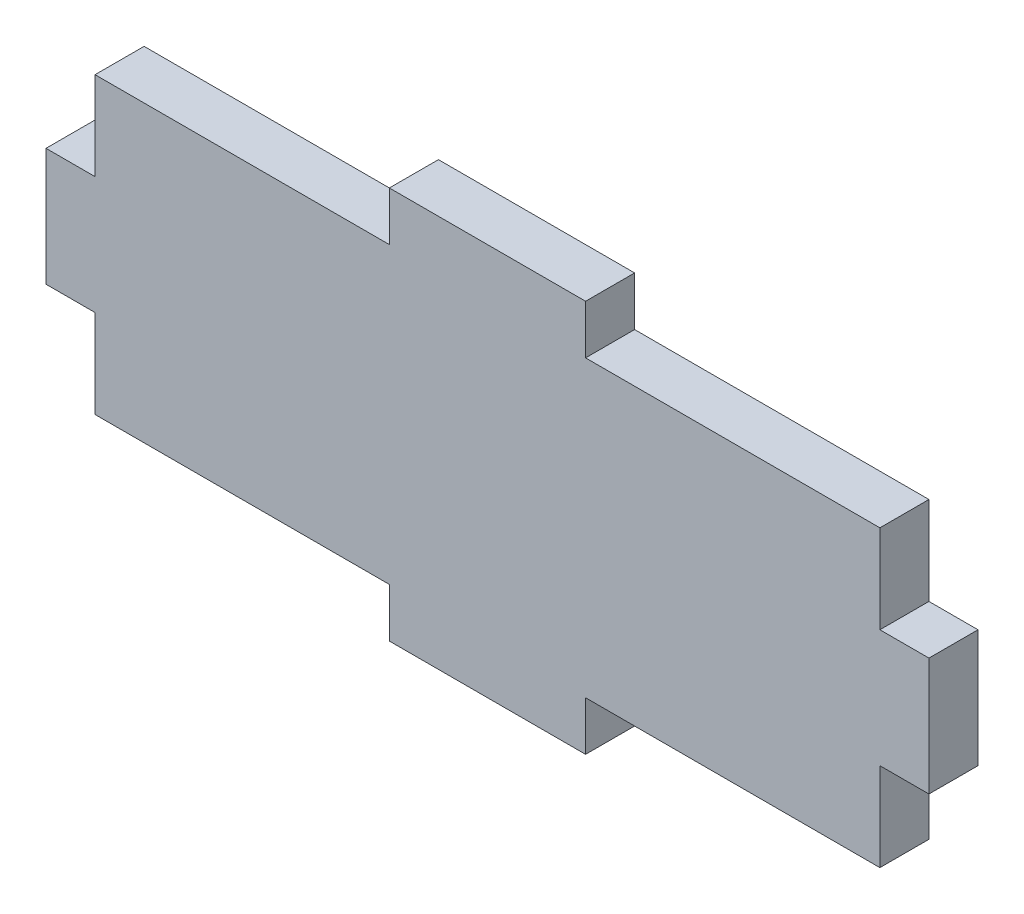
ISO-10303-21;
HEADER;
FILE_DESCRIPTION(('STEP AP214'),'2;1');
FILE_NAME('part.step','',(''),(''),'','','');
FILE_SCHEMA(('AUTOMOTIVE_DESIGN { 1 0 10303 214 1 1 1 1 }'));
ENDSEC;
DATA;
#1=APPLICATION_CONTEXT('core data for automotive mechanical design processes');
#2=APPLICATION_PROTOCOL_DEFINITION('international standard','automotive_design',2000,#1);
#3=PRODUCT_CONTEXT('',#1,'mechanical');
#4=PRODUCT('Part','Part','',(#3));
#5=PRODUCT_RELATED_PRODUCT_CATEGORY('part','',(#4));
#6=PRODUCT_DEFINITION_FORMATION('','',#4);
#7=PRODUCT_DEFINITION_CONTEXT('part definition',#1,'design');
#8=PRODUCT_DEFINITION('design','',#6,#7);
#9=PRODUCT_DEFINITION_SHAPE('','',#8);
#10=(LENGTH_UNIT() NAMED_UNIT(*) SI_UNIT(.MILLI.,.METRE.));
#11=(NAMED_UNIT(*) PLANE_ANGLE_UNIT() SI_UNIT($,.RADIAN.));
#12=(NAMED_UNIT(*) SI_UNIT($,.STERADIAN.) SOLID_ANGLE_UNIT());
#13=UNCERTAINTY_MEASURE_WITH_UNIT(LENGTH_MEASURE(1.E-05),#10,'distance_accuracy_value','');
#14=(GEOMETRIC_REPRESENTATION_CONTEXT(3) GLOBAL_UNCERTAINTY_ASSIGNED_CONTEXT((#13)) GLOBAL_UNIT_ASSIGNED_CONTEXT((#10,
#11,#12)) REPRESENTATION_CONTEXT('',''));
#15=CARTESIAN_POINT('',(0.,0.,0.));
#16=DIRECTION('',(0.,0.,1.));
#17=DIRECTION('',(1.,0.,0.));
#18=AXIS2_PLACEMENT_3D('',#15,#16,#17);
#19=CARTESIAN_POINT('',(-45.,6.,5.));
#20=DIRECTION('',(0.,-1.,0.));
#21=DIRECTION('',(0.,0.,-1.));
#22=AXIS2_PLACEMENT_3D('',#19,#20,#21);
#23=PLANE('',#22);
#24=DIRECTION('',(-1.,0.,0.));
#25=VECTOR('',#24,1.);
#26=CARTESIAN_POINT('',(-45.,6.,0.));
#27=LINE('',#26,#25);
#28=CARTESIAN_POINT('',(-40.,6.,0.));
#29=VERTEX_POINT('',#28);
#30=CARTESIAN_POINT('',(-45.,6.,0.));
#31=VERTEX_POINT('',#30);
#32=EDGE_CURVE('E201',#29,#31,#27,.T.);
#33=ORIENTED_EDGE('',*,*,#32,.T.);
#34=DIRECTION('',(0.,0.,-1.));
#35=VECTOR('',#34,1.);
#36=CARTESIAN_POINT('',(-45.,6.,5.));
#37=LINE('',#36,#35);
#38=CARTESIAN_POINT('',(-45.,6.,5.));
#39=VERTEX_POINT('',#38);
#40=EDGE_CURVE('E11',#39,#31,#37,.T.);
#41=ORIENTED_EDGE('',*,*,#40,.F.);
#42=DIRECTION('',(-1.,0.,0.));
#43=VECTOR('',#42,1.);
#44=CARTESIAN_POINT('',(-45.,6.,5.));
#45=LINE('',#44,#43);
#46=CARTESIAN_POINT('',(-40.,6.,5.));
#47=VERTEX_POINT('',#46);
#48=EDGE_CURVE('E239',#47,#39,#45,.T.);
#49=ORIENTED_EDGE('',*,*,#48,.F.);
#50=DIRECTION('',(0.,0.,-1.));
#51=VECTOR('',#50,1.);
#52=CARTESIAN_POINT('',(-40.,6.,5.));
#53=LINE('',#52,#51);
#54=EDGE_CURVE('E197',#47,#29,#53,.T.);
#55=ORIENTED_EDGE('',*,*,#54,.T.);
#56=EDGE_LOOP('',(#33,#41,#49,#55));
#57=FACE_BOUND('',#56,.T.);
#58=ADVANCED_FACE('F33',(#57),#23,.F.);
#59=CARTESIAN_POINT('',(-45.,-6.00000000000002,5.));
#60=DIRECTION('',(1.,0.,0.));
#61=DIRECTION('',(0.,0.,-1.));
#62=AXIS2_PLACEMENT_3D('',#59,#60,#61);
#63=PLANE('',#62);
#64=DIRECTION('',(0.,-1.,0.));
#65=VECTOR('',#64,1.);
#66=CARTESIAN_POINT('',(-45.,-6.00000000000002,0.));
#67=LINE('',#66,#65);
#68=CARTESIAN_POINT('',(-45.,-6.00000000000002,0.));
#69=VERTEX_POINT('',#68);
#70=EDGE_CURVE('E204',#31,#69,#67,.T.);
#71=ORIENTED_EDGE('',*,*,#70,.T.);
#72=DIRECTION('',(0.,0.,-1.));
#73=VECTOR('',#72,1.);
#74=CARTESIAN_POINT('',(-45.,-6.00000000000002,5.));
#75=LINE('',#74,#73);
#76=CARTESIAN_POINT('',(-45.,-6.00000000000002,5.));
#77=VERTEX_POINT('',#76);
#78=EDGE_CURVE('E41',#77,#69,#75,.T.);
#79=ORIENTED_EDGE('',*,*,#78,.F.);
#80=DIRECTION('',(0.,-1.,0.));
#81=VECTOR('',#80,1.);
#82=CARTESIAN_POINT('',(-45.,-6.00000000000002,5.));
#83=LINE('',#82,#81);
#84=EDGE_CURVE('E128',#39,#77,#83,.T.);
#85=ORIENTED_EDGE('',*,*,#84,.F.);
#86=ORIENTED_EDGE('',*,*,#40,.T.);
#87=EDGE_LOOP('',(#71,#79,#85,#86));
#88=FACE_BOUND('',#87,.T.);
#89=ADVANCED_FACE('F357',(#88),#63,.F.);
#90=CARTESIAN_POINT('',(-45.,-6.00000000000002,5.));
#91=DIRECTION('',(0.,1.,0.));
#92=DIRECTION('',(-1.,0.,0.));
#93=AXIS2_PLACEMENT_3D('',#90,#91,#92);
#94=PLANE('',#93);
#95=DIRECTION('',(1.,0.,0.));
#96=VECTOR('',#95,1.);
#97=CARTESIAN_POINT('',(-45.,-6.00000000000002,0.));
#98=LINE('',#97,#96);
#99=CARTESIAN_POINT('',(-40.,-6.00000000000002,0.));
#100=VERTEX_POINT('',#99);
#101=EDGE_CURVE('E206',#69,#100,#98,.T.);
#102=ORIENTED_EDGE('',*,*,#101,.T.);
#103=DIRECTION('',(0.,0.,-1.));
#104=VECTOR('',#103,1.);
#105=CARTESIAN_POINT('',(-40.,-6.00000000000002,5.));
#106=LINE('',#105,#104);
#107=CARTESIAN_POINT('',(-40.,-6.00000000000002,5.));
#108=VERTEX_POINT('',#107);
#109=EDGE_CURVE('E282',#108,#100,#106,.T.);
#110=ORIENTED_EDGE('',*,*,#109,.F.);
#111=DIRECTION('',(1.,0.,0.));
#112=VECTOR('',#111,1.);
#113=CARTESIAN_POINT('',(-45.,-6.00000000000002,5.));
#114=LINE('',#113,#112);
#115=EDGE_CURVE('E290',#77,#108,#114,.T.);
#116=ORIENTED_EDGE('',*,*,#115,.F.);
#117=ORIENTED_EDGE('',*,*,#78,.T.);
#118=EDGE_LOOP('',(#102,#110,#116,#117));
#119=FACE_BOUND('',#118,.T.);
#120=ADVANCED_FACE('F288',(#119),#94,.F.);
#121=CARTESIAN_POINT('',(-40.,-6.00000000000002,5.));
#122=DIRECTION('',(1.,0.,0.));
#123=DIRECTION('',(0.,1.,0.));
#124=AXIS2_PLACEMENT_3D('',#121,#122,#123);
#125=PLANE('',#124);
#126=DIRECTION('',(0.,-1.,0.));
#127=VECTOR('',#126,1.);
#128=CARTESIAN_POINT('',(-40.,-6.00000000000002,0.));
#129=LINE('',#128,#127);
#130=CARTESIAN_POINT('',(-40.,-15.,0.));
#131=VERTEX_POINT('',#130);
#132=EDGE_CURVE('E208',#100,#131,#129,.T.);
#133=ORIENTED_EDGE('',*,*,#132,.T.);
#134=DIRECTION('',(0.,0.,-1.));
#135=VECTOR('',#134,1.);
#136=CARTESIAN_POINT('',(-40.,-15.,5.));
#137=LINE('',#136,#135);
#138=CARTESIAN_POINT('',(-40.,-15.,5.));
#139=VERTEX_POINT('',#138);
#140=EDGE_CURVE('E279',#139,#131,#137,.T.);
#141=ORIENTED_EDGE('',*,*,#140,.F.);
#142=DIRECTION('',(0.,-1.,0.));
#143=VECTOR('',#142,1.);
#144=CARTESIAN_POINT('',(-40.,-6.00000000000002,5.));
#145=LINE('',#144,#143);
#146=EDGE_CURVE('E308',#108,#139,#145,.T.);
#147=ORIENTED_EDGE('',*,*,#146,.F.);
#148=ORIENTED_EDGE('',*,*,#109,.T.);
#149=EDGE_LOOP('',(#133,#141,#147,#148));
#150=FACE_BOUND('',#149,.T.);
#151=ADVANCED_FACE('F299',(#150),#125,.F.);
#152=CARTESIAN_POINT('',(-40.,-15.,5.));
#153=DIRECTION('',(0.,1.,0.));
#154=DIRECTION('',(-1.,0.,0.));
#155=AXIS2_PLACEMENT_3D('',#152,#153,#154);
#156=PLANE('',#155);
#157=DIRECTION('',(1.,0.,0.));
#158=VECTOR('',#157,1.);
#159=CARTESIAN_POINT('',(-40.,-15.,0.));
#160=LINE('',#159,#158);
#161=CARTESIAN_POINT('',(-10.,-15.,0.));
#162=VERTEX_POINT('',#161);
#163=EDGE_CURVE('E210',#131,#162,#160,.T.);
#164=ORIENTED_EDGE('',*,*,#163,.T.);
#165=DIRECTION('',(0.,0.,-1.));
#166=VECTOR('',#165,1.);
#167=CARTESIAN_POINT('',(-10.,-15.,5.));
#168=LINE('',#167,#166);
#169=CARTESIAN_POINT('',(-10.,-15.,5.));
#170=VERTEX_POINT('',#169);
#171=EDGE_CURVE('E276',#170,#162,#168,.T.);
#172=ORIENTED_EDGE('',*,*,#171,.F.);
#173=DIRECTION('',(1.,0.,0.));
#174=VECTOR('',#173,1.);
#175=CARTESIAN_POINT('',(-40.,-15.,5.));
#176=LINE('',#175,#174);
#177=EDGE_CURVE('E305',#139,#170,#176,.T.);
#178=ORIENTED_EDGE('',*,*,#177,.F.);
#179=ORIENTED_EDGE('',*,*,#140,.T.);
#180=EDGE_LOOP('',(#164,#172,#178,#179));
#181=FACE_BOUND('',#180,.T.);
#182=ADVANCED_FACE('F303',(#181),#156,.F.);
#183=CARTESIAN_POINT('',(-10.,-15.,5.));
#184=DIRECTION('',(1.,0.,0.));
#185=DIRECTION('',(0.,0.,-1.));
#186=AXIS2_PLACEMENT_3D('',#183,#184,#185);
#187=PLANE('',#186);
#188=DIRECTION('',(0.,-1.,0.));
#189=VECTOR('',#188,1.);
#190=CARTESIAN_POINT('',(-10.,-15.,0.));
#191=LINE('',#190,#189);
#192=CARTESIAN_POINT('',(-10.,-20.,0.));
#193=VERTEX_POINT('',#192);
#194=EDGE_CURVE('E212',#162,#193,#191,.T.);
#195=ORIENTED_EDGE('',*,*,#194,.T.);
#196=DIRECTION('',(0.,0.,-1.));
#197=VECTOR('',#196,1.);
#198=CARTESIAN_POINT('',(-10.,-20.,5.));
#199=LINE('',#198,#197);
#200=CARTESIAN_POINT('',(-10.,-20.,5.));
#201=VERTEX_POINT('',#200);
#202=EDGE_CURVE('E273',#201,#193,#199,.T.);
#203=ORIENTED_EDGE('',*,*,#202,.F.);
#204=DIRECTION('',(0.,-1.,0.));
#205=VECTOR('',#204,1.);
#206=CARTESIAN_POINT('',(-10.,-15.,5.));
#207=LINE('',#206,#205);
#208=EDGE_CURVE('E307',#170,#201,#207,.T.);
#209=ORIENTED_EDGE('',*,*,#208,.F.);
#210=ORIENTED_EDGE('',*,*,#171,.T.);
#211=EDGE_LOOP('',(#195,#203,#209,#210));
#212=FACE_BOUND('',#211,.T.);
#213=ADVANCED_FACE('F370',(#212),#187,.F.);
#214=CARTESIAN_POINT('',(-10.,-20.,5.));
#215=DIRECTION('',(0.,1.,0.));
#216=DIRECTION('',(0.,0.,1.));
#217=AXIS2_PLACEMENT_3D('',#214,#215,#216);
#218=PLANE('',#217);
#219=DIRECTION('',(1.,0.,0.));
#220=VECTOR('',#219,1.);
#221=CARTESIAN_POINT('',(-10.,-20.,0.));
#222=LINE('',#221,#220);
#223=CARTESIAN_POINT('',(10.,-20.,0.));
#224=VERTEX_POINT('',#223);
#225=EDGE_CURVE('E214',#193,#224,#222,.T.);
#226=ORIENTED_EDGE('',*,*,#225,.T.);
#227=DIRECTION('',(0.,0.,-1.));
#228=VECTOR('',#227,1.);
#229=CARTESIAN_POINT('',(10.,-20.,5.));
#230=LINE('',#229,#228);
#231=CARTESIAN_POINT('',(10.,-20.,5.));
#232=VERTEX_POINT('',#231);
#233=EDGE_CURVE('E270',#232,#224,#230,.T.);
#234=ORIENTED_EDGE('',*,*,#233,.F.);
#235=DIRECTION('',(1.,0.,0.));
#236=VECTOR('',#235,1.);
#237=CARTESIAN_POINT('',(-10.,-20.,5.));
#238=LINE('',#237,#236);
#239=EDGE_CURVE('E310',#201,#232,#238,.T.);
#240=ORIENTED_EDGE('',*,*,#239,.F.);
#241=ORIENTED_EDGE('',*,*,#202,.T.);
#242=EDGE_LOOP('',(#226,#234,#240,#241));
#243=FACE_BOUND('',#242,.T.);
#244=ADVANCED_FACE('F373',(#243),#218,.F.);
#245=CARTESIAN_POINT('',(10.,-15.,5.));
#246=DIRECTION('',(-1.,0.,0.));
#247=DIRECTION('',(0.,0.,1.));
#248=AXIS2_PLACEMENT_3D('',#245,#246,#247);
#249=PLANE('',#248);
#250=DIRECTION('',(0.,1.,0.));
#251=VECTOR('',#250,1.);
#252=CARTESIAN_POINT('',(10.,-15.,0.));
#253=LINE('',#252,#251);
#254=CARTESIAN_POINT('',(10.,-15.,0.));
#255=VERTEX_POINT('',#254);
#256=EDGE_CURVE('E216',#224,#255,#253,.T.);
#257=ORIENTED_EDGE('',*,*,#256,.T.);
#258=DIRECTION('',(0.,0.,-1.));
#259=VECTOR('',#258,1.);
#260=CARTESIAN_POINT('',(10.,-15.,5.));
#261=LINE('',#260,#259);
#262=CARTESIAN_POINT('',(10.,-15.,5.));
#263=VERTEX_POINT('',#262);
#264=EDGE_CURVE('E267',#263,#255,#261,.T.);
#265=ORIENTED_EDGE('',*,*,#264,.F.);
#266=DIRECTION('',(0.,1.,0.));
#267=VECTOR('',#266,1.);
#268=CARTESIAN_POINT('',(10.,-15.,5.));
#269=LINE('',#268,#267);
#270=EDGE_CURVE('E316',#232,#263,#269,.T.);
#271=ORIENTED_EDGE('',*,*,#270,.F.);
#272=ORIENTED_EDGE('',*,*,#233,.T.);
#273=EDGE_LOOP('',(#257,#265,#271,#272));
#274=FACE_BOUND('',#273,.T.);
#275=ADVANCED_FACE('F377',(#274),#249,.F.);
#276=CARTESIAN_POINT('',(40.,-15.,5.));
#277=DIRECTION('',(0.,1.,0.));
#278=DIRECTION('',(-1.,0.,0.));
#279=AXIS2_PLACEMENT_3D('',#276,#277,#278);
#280=PLANE('',#279);
#281=DIRECTION('',(1.,0.,0.));
#282=VECTOR('',#281,1.);
#283=CARTESIAN_POINT('',(40.,-15.,0.));
#284=LINE('',#283,#282);
#285=CARTESIAN_POINT('',(40.,-15.,0.));
#286=VERTEX_POINT('',#285);
#287=EDGE_CURVE('E218',#255,#286,#284,.T.);
#288=ORIENTED_EDGE('',*,*,#287,.T.);
#289=DIRECTION('',(0.,0.,-1.));
#290=VECTOR('',#289,1.);
#291=CARTESIAN_POINT('',(40.,-15.,5.));
#292=LINE('',#291,#290);
#293=CARTESIAN_POINT('',(40.,-15.,5.));
#294=VERTEX_POINT('',#293);
#295=EDGE_CURVE('E264',#294,#286,#292,.T.);
#296=ORIENTED_EDGE('',*,*,#295,.F.);
#297=DIRECTION('',(1.,0.,0.));
#298=VECTOR('',#297,1.);
#299=CARTESIAN_POINT('',(40.,-15.,5.));
#300=LINE('',#299,#298);
#301=EDGE_CURVE('E318',#263,#294,#300,.T.);
#302=ORIENTED_EDGE('',*,*,#301,.F.);
#303=ORIENTED_EDGE('',*,*,#264,.T.);
#304=EDGE_LOOP('',(#288,#296,#302,#303));
#305=FACE_BOUND('',#304,.T.);
#306=ADVANCED_FACE('F381',(#305),#280,.F.);
#307=CARTESIAN_POINT('',(40.,-6.00000000000001,5.));
#308=DIRECTION('',(-1.,0.,0.));
#309=DIRECTION('',(0.,-1.,0.));
#310=AXIS2_PLACEMENT_3D('',#307,#308,#309);
#311=PLANE('',#310);
#312=DIRECTION('',(0.,1.,0.));
#313=VECTOR('',#312,1.);
#314=CARTESIAN_POINT('',(40.,-6.00000000000001,0.));
#315=LINE('',#314,#313);
#316=CARTESIAN_POINT('',(40.,-6.00000000000001,0.));
#317=VERTEX_POINT('',#316);
#318=EDGE_CURVE('E220',#286,#317,#315,.T.);
#319=ORIENTED_EDGE('',*,*,#318,.T.);
#320=DIRECTION('',(0.,0.,-1.));
#321=VECTOR('',#320,1.);
#322=CARTESIAN_POINT('',(40.,-6.00000000000001,5.));
#323=LINE('',#322,#321);
#324=CARTESIAN_POINT('',(40.,-6.00000000000001,5.));
#325=VERTEX_POINT('',#324);
#326=EDGE_CURVE('E261',#325,#317,#323,.T.);
#327=ORIENTED_EDGE('',*,*,#326,.F.);
#328=DIRECTION('',(0.,1.,0.));
#329=VECTOR('',#328,1.);
#330=CARTESIAN_POINT('',(40.,-6.00000000000001,5.));
#331=LINE('',#330,#329);
#332=EDGE_CURVE('E320',#294,#325,#331,.T.);
#333=ORIENTED_EDGE('',*,*,#332,.F.);
#334=ORIENTED_EDGE('',*,*,#295,.T.);
#335=EDGE_LOOP('',(#319,#327,#333,#334));
#336=FACE_BOUND('',#335,.T.);
#337=ADVANCED_FACE('F385',(#336),#311,.F.);
#338=CARTESIAN_POINT('',(45.,-6.00000000000001,5.));
#339=DIRECTION('',(0.,1.,0.));
#340=DIRECTION('',(-1.,0.,0.));
#341=AXIS2_PLACEMENT_3D('',#338,#339,#340);
#342=PLANE('',#341);
#343=DIRECTION('',(1.,0.,0.));
#344=VECTOR('',#343,1.);
#345=CARTESIAN_POINT('',(45.,-6.00000000000001,0.));
#346=LINE('',#345,#344);
#347=CARTESIAN_POINT('',(45.,-6.00000000000001,0.));
#348=VERTEX_POINT('',#347);
#349=EDGE_CURVE('E222',#317,#348,#346,.T.);
#350=ORIENTED_EDGE('',*,*,#349,.T.);
#351=DIRECTION('',(0.,0.,-1.));
#352=VECTOR('',#351,1.);
#353=CARTESIAN_POINT('',(45.,-6.00000000000001,5.));
#354=LINE('',#353,#352);
#355=CARTESIAN_POINT('',(45.,-6.00000000000001,5.));
#356=VERTEX_POINT('',#355);
#357=EDGE_CURVE('E258',#356,#348,#354,.T.);
#358=ORIENTED_EDGE('',*,*,#357,.F.);
#359=DIRECTION('',(1.,0.,0.));
#360=VECTOR('',#359,1.);
#361=CARTESIAN_POINT('',(45.,-6.00000000000001,5.));
#362=LINE('',#361,#360);
#363=EDGE_CURVE('E322',#325,#356,#362,.T.);
#364=ORIENTED_EDGE('',*,*,#363,.F.);
#365=ORIENTED_EDGE('',*,*,#326,.T.);
#366=EDGE_LOOP('',(#350,#358,#364,#365));
#367=FACE_BOUND('',#366,.T.);
#368=ADVANCED_FACE('F389',(#367),#342,.F.);
#369=CARTESIAN_POINT('',(45.,-6.00000000000001,5.));
#370=DIRECTION('',(-1.,0.,0.));
#371=DIRECTION('',(0.,0.,1.));
#372=AXIS2_PLACEMENT_3D('',#369,#370,#371);
#373=PLANE('',#372);
#374=DIRECTION('',(0.,1.,0.));
#375=VECTOR('',#374,1.);
#376=CARTESIAN_POINT('',(45.,-6.00000000000001,0.));
#377=LINE('',#376,#375);
#378=CARTESIAN_POINT('',(45.,6.00000000000001,0.));
#379=VERTEX_POINT('',#378);
#380=EDGE_CURVE('E224',#348,#379,#377,.T.);
#381=ORIENTED_EDGE('',*,*,#380,.T.);
#382=DIRECTION('',(0.,0.,-1.));
#383=VECTOR('',#382,1.);
#384=CARTESIAN_POINT('',(45.,6.00000000000001,5.));
#385=LINE('',#384,#383);
#386=CARTESIAN_POINT('',(45.,6.00000000000001,5.));
#387=VERTEX_POINT('',#386);
#388=EDGE_CURVE('E255',#387,#379,#385,.T.);
#389=ORIENTED_EDGE('',*,*,#388,.F.);
#390=DIRECTION('',(0.,1.,0.));
#391=VECTOR('',#390,1.);
#392=CARTESIAN_POINT('',(45.,-6.00000000000001,5.));
#393=LINE('',#392,#391);
#394=EDGE_CURVE('E324',#356,#387,#393,.T.);
#395=ORIENTED_EDGE('',*,*,#394,.F.);
#396=ORIENTED_EDGE('',*,*,#357,.T.);
#397=EDGE_LOOP('',(#381,#389,#395,#396));
#398=FACE_BOUND('',#397,.T.);
#399=ADVANCED_FACE('F393',(#398),#373,.F.);
#400=CARTESIAN_POINT('',(45.,6.00000000000001,5.));
#401=DIRECTION('',(0.,-1.,0.));
#402=DIRECTION('',(1.,0.,0.));
#403=AXIS2_PLACEMENT_3D('',#400,#401,#402);
#404=PLANE('',#403);
#405=DIRECTION('',(-1.,0.,0.));
#406=VECTOR('',#405,1.);
#407=CARTESIAN_POINT('',(45.,6.00000000000001,0.));
#408=LINE('',#407,#406);
#409=CARTESIAN_POINT('',(40.,6.00000000000001,0.));
#410=VERTEX_POINT('',#409);
#411=EDGE_CURVE('E226',#379,#410,#408,.T.);
#412=ORIENTED_EDGE('',*,*,#411,.T.);
#413=DIRECTION('',(0.,0.,-1.));
#414=VECTOR('',#413,1.);
#415=CARTESIAN_POINT('',(40.,6.00000000000001,5.));
#416=LINE('',#415,#414);
#417=CARTESIAN_POINT('',(40.,6.00000000000001,5.));
#418=VERTEX_POINT('',#417);
#419=EDGE_CURVE('E252',#418,#410,#416,.T.);
#420=ORIENTED_EDGE('',*,*,#419,.F.);
#421=DIRECTION('',(-1.,0.,0.));
#422=VECTOR('',#421,1.);
#423=CARTESIAN_POINT('',(45.,6.00000000000001,5.));
#424=LINE('',#423,#422);
#425=EDGE_CURVE('E326',#387,#418,#424,.T.);
#426=ORIENTED_EDGE('',*,*,#425,.F.);
#427=ORIENTED_EDGE('',*,*,#388,.T.);
#428=EDGE_LOOP('',(#412,#420,#426,#427));
#429=FACE_BOUND('',#428,.T.);
#430=ADVANCED_FACE('F397',(#429),#404,.F.);
#431=CARTESIAN_POINT('',(40.,6.00000000000001,5.));
#432=DIRECTION('',(-1.,0.,0.));
#433=DIRECTION('',(0.,-1.,0.));
#434=AXIS2_PLACEMENT_3D('',#431,#432,#433);
#435=PLANE('',#434);
#436=DIRECTION('',(0.,1.,0.));
#437=VECTOR('',#436,1.);
#438=CARTESIAN_POINT('',(40.,6.00000000000001,0.));
#439=LINE('',#438,#437);
#440=CARTESIAN_POINT('',(40.,15.,0.));
#441=VERTEX_POINT('',#440);
#442=EDGE_CURVE('E228',#410,#441,#439,.T.);
#443=ORIENTED_EDGE('',*,*,#442,.T.);
#444=DIRECTION('',(0.,0.,-1.));
#445=VECTOR('',#444,1.);
#446=CARTESIAN_POINT('',(40.,15.,5.));
#447=LINE('',#446,#445);
#448=CARTESIAN_POINT('',(40.,15.,5.));
#449=VERTEX_POINT('',#448);
#450=EDGE_CURVE('E249',#449,#441,#447,.T.);
#451=ORIENTED_EDGE('',*,*,#450,.F.);
#452=DIRECTION('',(0.,1.,0.));
#453=VECTOR('',#452,1.);
#454=CARTESIAN_POINT('',(40.,6.00000000000001,5.));
#455=LINE('',#454,#453);
#456=EDGE_CURVE('E328',#418,#449,#455,.T.);
#457=ORIENTED_EDGE('',*,*,#456,.F.);
#458=ORIENTED_EDGE('',*,*,#419,.T.);
#459=EDGE_LOOP('',(#443,#451,#457,#458));
#460=FACE_BOUND('',#459,.T.);
#461=ADVANCED_FACE('F401',(#460),#435,.F.);
#462=CARTESIAN_POINT('',(40.,15.,5.));
#463=DIRECTION('',(0.,-1.,0.));
#464=DIRECTION('',(1.,0.,0.));
#465=AXIS2_PLACEMENT_3D('',#462,#463,#464);
#466=PLANE('',#465);
#467=DIRECTION('',(-1.,0.,0.));
#468=VECTOR('',#467,1.);
#469=CARTESIAN_POINT('',(40.,15.,0.));
#470=LINE('',#469,#468);
#471=CARTESIAN_POINT('',(10.,15.,0.));
#472=VERTEX_POINT('',#471);
#473=EDGE_CURVE('E230',#441,#472,#470,.T.);
#474=ORIENTED_EDGE('',*,*,#473,.T.);
#475=DIRECTION('',(0.,0.,-1.));
#476=VECTOR('',#475,1.);
#477=CARTESIAN_POINT('',(10.,15.,5.));
#478=LINE('',#477,#476);
#479=CARTESIAN_POINT('',(10.,15.,5.));
#480=VERTEX_POINT('',#479);
#481=EDGE_CURVE('E246',#480,#472,#478,.T.);
#482=ORIENTED_EDGE('',*,*,#481,.F.);
#483=DIRECTION('',(-1.,0.,0.));
#484=VECTOR('',#483,1.);
#485=CARTESIAN_POINT('',(40.,15.,5.));
#486=LINE('',#485,#484);
#487=EDGE_CURVE('E330',#449,#480,#486,.T.);
#488=ORIENTED_EDGE('',*,*,#487,.F.);
#489=ORIENTED_EDGE('',*,*,#450,.T.);
#490=EDGE_LOOP('',(#474,#482,#488,#489));
#491=FACE_BOUND('',#490,.T.);
#492=ADVANCED_FACE('F405',(#491),#466,.F.);
#493=CARTESIAN_POINT('',(10.,15.,5.));
#494=DIRECTION('',(-1.,0.,0.));
#495=DIRECTION('',(0.,0.,1.));
#496=AXIS2_PLACEMENT_3D('',#493,#494,#495);
#497=PLANE('',#496);
#498=DIRECTION('',(0.,1.,0.));
#499=VECTOR('',#498,1.);
#500=CARTESIAN_POINT('',(10.,15.,0.));
#501=LINE('',#500,#499);
#502=CARTESIAN_POINT('',(10.,20.,0.));
#503=VERTEX_POINT('',#502);
#504=EDGE_CURVE('E232',#472,#503,#501,.T.);
#505=ORIENTED_EDGE('',*,*,#504,.T.);
#506=DIRECTION('',(0.,0.,-1.));
#507=VECTOR('',#506,1.);
#508=CARTESIAN_POINT('',(10.,20.,5.));
#509=LINE('',#508,#507);
#510=CARTESIAN_POINT('',(10.,20.,5.));
#511=VERTEX_POINT('',#510);
#512=EDGE_CURVE('E243',#511,#503,#509,.T.);
#513=ORIENTED_EDGE('',*,*,#512,.F.);
#514=DIRECTION('',(0.,1.,0.));
#515=VECTOR('',#514,1.);
#516=CARTESIAN_POINT('',(10.,15.,5.));
#517=LINE('',#516,#515);
#518=EDGE_CURVE('E332',#480,#511,#517,.T.);
#519=ORIENTED_EDGE('',*,*,#518,.F.);
#520=ORIENTED_EDGE('',*,*,#481,.T.);
#521=EDGE_LOOP('',(#505,#513,#519,#520));
#522=FACE_BOUND('',#521,.T.);
#523=ADVANCED_FACE('F338',(#522),#497,.F.);
#524=CARTESIAN_POINT('',(-10.,20.,5.));
#525=DIRECTION('',(0.,-1.,0.));
#526=DIRECTION('',(0.,0.,-1.));
#527=AXIS2_PLACEMENT_3D('',#524,#525,#526);
#528=PLANE('',#527);
#529=DIRECTION('',(-1.,0.,0.));
#530=VECTOR('',#529,1.);
#531=CARTESIAN_POINT('',(-10.,20.,0.));
#532=LINE('',#531,#530);
#533=CARTESIAN_POINT('',(-10.,20.,0.));
#534=VERTEX_POINT('',#533);
#535=EDGE_CURVE('E234',#503,#534,#532,.T.);
#536=ORIENTED_EDGE('',*,*,#535,.T.);
#537=DIRECTION('',(0.,0.,-1.));
#538=VECTOR('',#537,1.);
#539=CARTESIAN_POINT('',(-10.,20.,5.));
#540=LINE('',#539,#538);
#541=CARTESIAN_POINT('',(-10.,20.,5.));
#542=VERTEX_POINT('',#541);
#543=EDGE_CURVE('E192',#542,#534,#540,.T.);
#544=ORIENTED_EDGE('',*,*,#543,.F.);
#545=DIRECTION('',(-1.,0.,0.));
#546=VECTOR('',#545,1.);
#547=CARTESIAN_POINT('',(-10.,20.,5.));
#548=LINE('',#547,#546);
#549=EDGE_CURVE('E183',#511,#542,#548,.T.);
#550=ORIENTED_EDGE('',*,*,#549,.F.);
#551=ORIENTED_EDGE('',*,*,#512,.T.);
#552=EDGE_LOOP('',(#536,#544,#550,#551));
#553=FACE_BOUND('',#552,.T.);
#554=ADVANCED_FACE('F342',(#553),#528,.F.);
#555=CARTESIAN_POINT('',(-10.,15.,5.));
#556=DIRECTION('',(1.,0.,0.));
#557=DIRECTION('',(0.,0.,-1.));
#558=AXIS2_PLACEMENT_3D('',#555,#556,#557);
#559=PLANE('',#558);
#560=DIRECTION('',(0.,-1.,0.));
#561=VECTOR('',#560,1.);
#562=CARTESIAN_POINT('',(-10.,15.,0.));
#563=LINE('',#562,#561);
#564=CARTESIAN_POINT('',(-10.,15.,0.));
#565=VERTEX_POINT('',#564);
#566=EDGE_CURVE('E191',#534,#565,#563,.T.);
#567=ORIENTED_EDGE('',*,*,#566,.T.);
#568=DIRECTION('',(0.,0.,-1.));
#569=VECTOR('',#568,1.);
#570=CARTESIAN_POINT('',(-10.,15.,5.));
#571=LINE('',#570,#569);
#572=CARTESIAN_POINT('',(-10.,15.,5.));
#573=VERTEX_POINT('',#572);
#574=EDGE_CURVE('E188',#573,#565,#571,.T.);
#575=ORIENTED_EDGE('',*,*,#574,.F.);
#576=DIRECTION('',(0.,-1.,0.));
#577=VECTOR('',#576,1.);
#578=CARTESIAN_POINT('',(-10.,15.,5.));
#579=LINE('',#578,#577);
#580=EDGE_CURVE('E177',#542,#573,#579,.T.);
#581=ORIENTED_EDGE('',*,*,#580,.F.);
#582=ORIENTED_EDGE('',*,*,#543,.T.);
#583=EDGE_LOOP('',(#567,#575,#581,#582));
#584=FACE_BOUND('',#583,.T.);
#585=ADVANCED_FACE('F189',(#584),#559,.F.);
#586=CARTESIAN_POINT('',(-40.,15.,5.));
#587=DIRECTION('',(0.,-1.,0.));
#588=DIRECTION('',(0.,0.,-1.));
#589=AXIS2_PLACEMENT_3D('',#586,#587,#588);
#590=PLANE('',#589);
#591=DIRECTION('',(-1.,0.,0.));
#592=VECTOR('',#591,1.);
#593=CARTESIAN_POINT('',(-40.,15.,0.));
#594=LINE('',#593,#592);
#595=CARTESIAN_POINT('',(-40.,15.,0.));
#596=VERTEX_POINT('',#595);
#597=EDGE_CURVE('E114',#565,#596,#594,.T.);
#598=ORIENTED_EDGE('',*,*,#597,.T.);
#599=DIRECTION('',(0.,0.,-1.));
#600=VECTOR('',#599,1.);
#601=CARTESIAN_POINT('',(-40.,15.,5.));
#602=LINE('',#601,#600);
#603=CARTESIAN_POINT('',(-40.,15.,5.));
#604=VERTEX_POINT('',#603);
#605=EDGE_CURVE('E193',#604,#596,#602,.T.);
#606=ORIENTED_EDGE('',*,*,#605,.F.);
#607=DIRECTION('',(-1.,0.,0.));
#608=VECTOR('',#607,1.);
#609=CARTESIAN_POINT('',(-40.,15.,5.));
#610=LINE('',#609,#608);
#611=EDGE_CURVE('E181',#573,#604,#610,.T.);
#612=ORIENTED_EDGE('',*,*,#611,.F.);
#613=ORIENTED_EDGE('',*,*,#574,.T.);
#614=EDGE_LOOP('',(#598,#606,#612,#613));
#615=FACE_BOUND('',#614,.T.);
#616=ADVANCED_FACE('F195',(#615),#590,.F.);
#617=CARTESIAN_POINT('',(-40.,6.,5.));
#618=DIRECTION('',(1.,0.,0.));
#619=DIRECTION('',(0.,0.,-1.));
#620=AXIS2_PLACEMENT_3D('',#617,#618,#619);
#621=PLANE('',#620);
#622=DIRECTION('',(0.,-1.,0.));
#623=VECTOR('',#622,1.);
#624=CARTESIAN_POINT('',(-40.,6.,0.));
#625=LINE('',#624,#623);
#626=EDGE_CURVE('E120',#596,#29,#625,.T.);
#627=ORIENTED_EDGE('',*,*,#626,.T.);
#628=ORIENTED_EDGE('',*,*,#54,.F.);
#629=DIRECTION('',(0.,-1.,0.));
#630=VECTOR('',#629,1.);
#631=CARTESIAN_POINT('',(-40.,6.,5.));
#632=LINE('',#631,#630);
#633=EDGE_CURVE('E49',#604,#47,#632,.T.);
#634=ORIENTED_EDGE('',*,*,#633,.F.);
#635=ORIENTED_EDGE('',*,*,#605,.T.);
#636=EDGE_LOOP('',(#627,#628,#634,#635));
#637=FACE_BOUND('',#636,.T.);
#638=ADVANCED_FACE('F346',(#637),#621,.F.);
#639=CARTESIAN_POINT('',(0.,0.,5.));
#640=DIRECTION('',(0.,0.,1.));
#641=DIRECTION('',(1.,0.,0.));
#642=AXIS2_PLACEMENT_3D('',#639,#640,#641);
#643=PLANE('',#642);
#644=ORIENTED_EDGE('',*,*,#48,.T.);
#645=ORIENTED_EDGE('',*,*,#84,.T.);
#646=ORIENTED_EDGE('',*,*,#115,.T.);
#647=ORIENTED_EDGE('',*,*,#146,.T.);
#648=ORIENTED_EDGE('',*,*,#177,.T.);
#649=ORIENTED_EDGE('',*,*,#208,.T.);
#650=ORIENTED_EDGE('',*,*,#239,.T.);
#651=ORIENTED_EDGE('',*,*,#270,.T.);
#652=ORIENTED_EDGE('',*,*,#301,.T.);
#653=ORIENTED_EDGE('',*,*,#332,.T.);
#654=ORIENTED_EDGE('',*,*,#363,.T.);
#655=ORIENTED_EDGE('',*,*,#394,.T.);
#656=ORIENTED_EDGE('',*,*,#425,.T.);
#657=ORIENTED_EDGE('',*,*,#456,.T.);
#658=ORIENTED_EDGE('',*,*,#487,.T.);
#659=ORIENTED_EDGE('',*,*,#518,.T.);
#660=ORIENTED_EDGE('',*,*,#549,.T.);
#661=ORIENTED_EDGE('',*,*,#580,.T.);
#662=ORIENTED_EDGE('',*,*,#611,.T.);
#663=ORIENTED_EDGE('',*,*,#633,.T.);
#664=EDGE_LOOP('',(#644,#645,#646,#647,#648,#649,#650,#651,#652,#653,#654,#655,#656,#657,#658,
#659,#660,#661,#662,#663));
#665=FACE_BOUND('',#664,.T.);
#666=ADVANCED_FACE('F179',(#665),#643,.T.);
#667=CARTESIAN_POINT('',(0.,0.,0.));
#668=DIRECTION('',(0.,0.,1.));
#669=DIRECTION('',(1.,0.,0.));
#670=AXIS2_PLACEMENT_3D('',#667,#668,#669);
#671=PLANE('',#670);
#672=ORIENTED_EDGE('',*,*,#32,.F.);
#673=ORIENTED_EDGE('',*,*,#626,.F.);
#674=ORIENTED_EDGE('',*,*,#597,.F.);
#675=ORIENTED_EDGE('',*,*,#566,.F.);
#676=ORIENTED_EDGE('',*,*,#535,.F.);
#677=ORIENTED_EDGE('',*,*,#504,.F.);
#678=ORIENTED_EDGE('',*,*,#473,.F.);
#679=ORIENTED_EDGE('',*,*,#442,.F.);
#680=ORIENTED_EDGE('',*,*,#411,.F.);
#681=ORIENTED_EDGE('',*,*,#380,.F.);
#682=ORIENTED_EDGE('',*,*,#349,.F.);
#683=ORIENTED_EDGE('',*,*,#318,.F.);
#684=ORIENTED_EDGE('',*,*,#287,.F.);
#685=ORIENTED_EDGE('',*,*,#256,.F.);
#686=ORIENTED_EDGE('',*,*,#225,.F.);
#687=ORIENTED_EDGE('',*,*,#194,.F.);
#688=ORIENTED_EDGE('',*,*,#163,.F.);
#689=ORIENTED_EDGE('',*,*,#132,.F.);
#690=ORIENTED_EDGE('',*,*,#101,.F.);
#691=ORIENTED_EDGE('',*,*,#70,.F.);
#692=EDGE_LOOP('',(#672,#673,#674,#675,#676,#677,#678,#679,#680,#681,#682,#683,#684,#685,#686,
#687,#688,#689,#690,#691));
#693=FACE_BOUND('',#692,.T.);
#694=ADVANCED_FACE('F294',(#693),#671,.F.);
#695=CLOSED_SHELL('',(#58,#89,#120,#151,#182,#213,#244,#275,#306,#337,#368,#399,#430,#461,#492,
#523,#554,#585,#616,#638,#666,#694));
#696=MANIFOLD_SOLID_BREP('B2',#695);
#697=ADVANCED_BREP_SHAPE_REPRESENTATION('',(#18,#696),#14);
#698=SHAPE_DEFINITION_REPRESENTATION(#9,#697);
ENDSEC;
END-ISO-10303-21;
